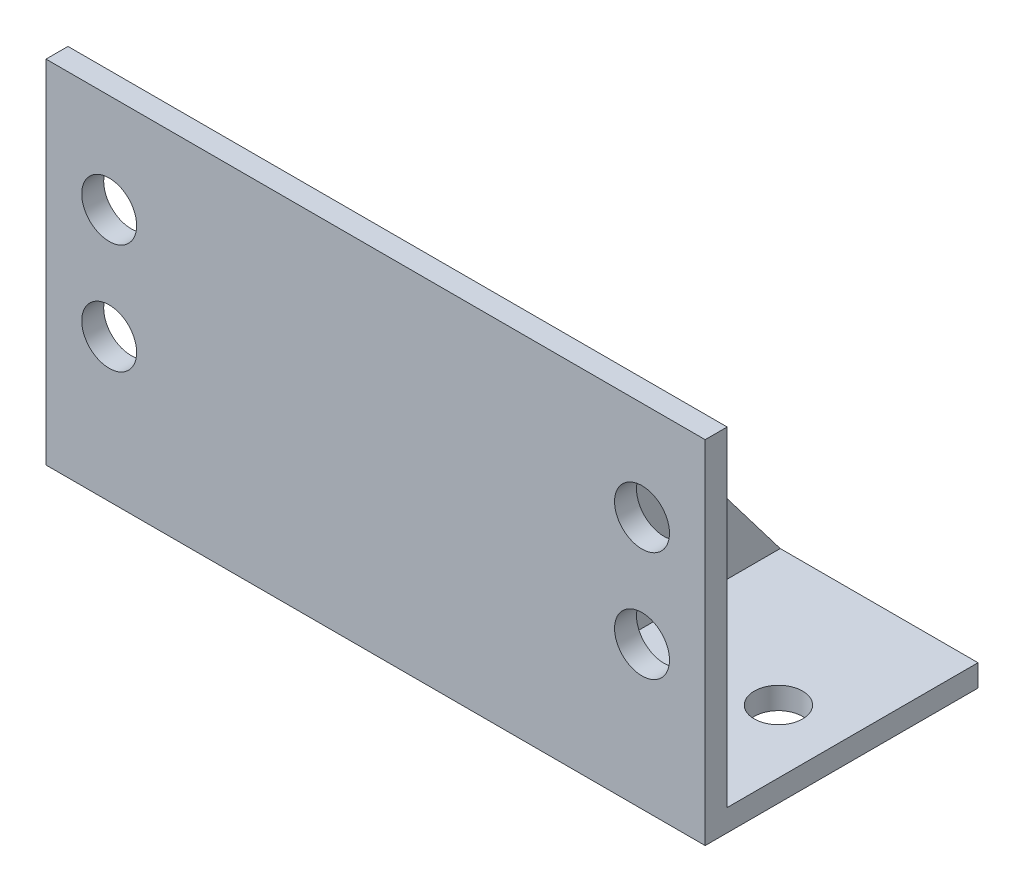
ISO-10303-21;
HEADER;
FILE_DESCRIPTION(('STEP AP214'),'2;1');
FILE_NAME('part.step','',(''),(''),'','','');
FILE_SCHEMA(('AUTOMOTIVE_DESIGN { 1 0 10303 214 1 1 1 1 }'));
ENDSEC;
DATA;
#1=APPLICATION_CONTEXT('core data for automotive mechanical design processes');
#2=APPLICATION_PROTOCOL_DEFINITION('international standard','automotive_design',2000,#1);
#3=PRODUCT_CONTEXT('',#1,'mechanical');
#4=PRODUCT('Part','Part','',(#3));
#5=PRODUCT_RELATED_PRODUCT_CATEGORY('part','',(#4));
#6=PRODUCT_DEFINITION_FORMATION('','',#4);
#7=PRODUCT_DEFINITION_CONTEXT('part definition',#1,'design');
#8=PRODUCT_DEFINITION('design','',#6,#7);
#9=PRODUCT_DEFINITION_SHAPE('','',#8);
#10=(LENGTH_UNIT() NAMED_UNIT(*) SI_UNIT(.MILLI.,.METRE.));
#11=(NAMED_UNIT(*) PLANE_ANGLE_UNIT() SI_UNIT($,.RADIAN.));
#12=(NAMED_UNIT(*) SI_UNIT($,.STERADIAN.) SOLID_ANGLE_UNIT());
#13=UNCERTAINTY_MEASURE_WITH_UNIT(LENGTH_MEASURE(1.E-05),#10,'distance_accuracy_value','');
#14=(GEOMETRIC_REPRESENTATION_CONTEXT(3) GLOBAL_UNCERTAINTY_ASSIGNED_CONTEXT((#13)) GLOBAL_UNIT_ASSIGNED_CONTEXT((#10,
#11,#12)) REPRESENTATION_CONTEXT('',''));
#15=CARTESIAN_POINT('',(0.,0.,0.));
#16=DIRECTION('',(0.,0.,1.));
#17=DIRECTION('',(1.,0.,0.));
#18=AXIS2_PLACEMENT_3D('',#15,#16,#17);
#19=CARTESIAN_POINT('',(10.,32.,-12.4164964055997));
#20=DIRECTION('',(1.,0.,0.));
#21=DIRECTION('',(0.,0.,-1.));
#22=AXIS2_PLACEMENT_3D('',#19,#20,#21);
#23=PLANE('',#22);
#24=DIRECTION('',(0.,0.795740414878261,0.605637839083205));
#25=VECTOR('',#24,1.);
#26=CARTESIAN_POINT('',(10.,20.9960842361188,2.04141875454158));
#27=LINE('',#26,#25);
#28=CARTESIAN_POINT('',(10.,2.,-12.4164964055997));
#29=VERTEX_POINT('',#28);
#30=CARTESIAN_POINT('',(10.,32.,10.4164964055997));
#31=VERTEX_POINT('',#30);
#32=EDGE_CURVE('E245',#29,#31,#27,.T.);
#33=ORIENTED_EDGE('',*,*,#32,.F.);
#34=DIRECTION('',(0.,0.,1.));
#35=VECTOR('',#34,1.);
#36=CARTESIAN_POINT('',(10.,2.,-12.4164964055997));
#37=LINE('',#36,#35);
#38=CARTESIAN_POINT('',(10.,2.,10.4164964055997));
#39=VERTEX_POINT('',#38);
#40=EDGE_CURVE('E231',#29,#39,#37,.T.);
#41=ORIENTED_EDGE('',*,*,#40,.T.);
#42=DIRECTION('',(0.,-1.,0.));
#43=VECTOR('',#42,1.);
#44=CARTESIAN_POINT('',(10.,32.,10.4164964055997));
#45=LINE('',#44,#43);
#46=EDGE_CURVE('E234',#31,#39,#45,.T.);
#47=ORIENTED_EDGE('',*,*,#46,.F.);
#48=EDGE_LOOP('',(#33,#41,#47));
#49=FACE_BOUND('',#48,.T.);
#50=ADVANCED_FACE('F88',(#49),#23,.F.);
#51=CARTESIAN_POINT('',(12.,32.,-12.4164964055997));
#52=DIRECTION('',(1.,0.,0.));
#53=DIRECTION('',(0.,0.,-1.));
#54=AXIS2_PLACEMENT_3D('',#51,#52,#53);
#55=PLANE('',#54);
#56=DIRECTION('',(0.,0.,1.));
#57=VECTOR('',#56,1.);
#58=CARTESIAN_POINT('',(12.,2.,-12.4164964055997));
#59=LINE('',#58,#57);
#60=CARTESIAN_POINT('',(12.,2.,-12.4164964055997));
#61=VERTEX_POINT('',#60);
#62=CARTESIAN_POINT('',(12.,2.,10.4164964055997));
#63=VERTEX_POINT('',#62);
#64=EDGE_CURVE('E103',#61,#63,#59,.T.);
#65=ORIENTED_EDGE('',*,*,#64,.F.);
#66=DIRECTION('',(0.,0.795740414878261,0.605637839083205));
#67=VECTOR('',#66,1.);
#68=CARTESIAN_POINT('',(12.,20.9960842361188,2.04141875454158));
#69=LINE('',#68,#67);
#70=CARTESIAN_POINT('',(12.,32.,10.4164964055997));
#71=VERTEX_POINT('',#70);
#72=EDGE_CURVE('E242',#61,#71,#69,.T.);
#73=ORIENTED_EDGE('',*,*,#72,.T.);
#74=DIRECTION('',(0.,-1.,0.));
#75=VECTOR('',#74,1.);
#76=CARTESIAN_POINT('',(12.,32.,10.4164964055997));
#77=LINE('',#76,#75);
#78=EDGE_CURVE('E235',#71,#63,#77,.T.);
#79=ORIENTED_EDGE('',*,*,#78,.T.);
#80=EDGE_LOOP('',(#65,#73,#79));
#81=FACE_BOUND('',#80,.T.);
#82=ADVANCED_FACE('F361',(#81),#55,.T.);
#83=CARTESIAN_POINT('',(-10.,32.,-12.4164964055997));
#84=DIRECTION('',(1.,0.,0.));
#85=DIRECTION('',(0.,0.,-1.));
#86=AXIS2_PLACEMENT_3D('',#83,#84,#85);
#87=PLANE('',#86);
#88=DIRECTION('',(0.,0.,1.));
#89=VECTOR('',#88,1.);
#90=CARTESIAN_POINT('',(-10.,2.,-12.4164964055997));
#91=LINE('',#90,#89);
#92=CARTESIAN_POINT('',(-10.,2.,-12.4164964055997));
#93=VERTEX_POINT('',#92);
#94=CARTESIAN_POINT('',(-10.,2.,10.4164964055997));
#95=VERTEX_POINT('',#94);
#96=EDGE_CURVE('E244',#93,#95,#91,.T.);
#97=ORIENTED_EDGE('',*,*,#96,.F.);
#98=DIRECTION('',(0.,0.795740414878261,0.605637839083205));
#99=VECTOR('',#98,1.);
#100=CARTESIAN_POINT('',(-10.,20.9960842361188,2.04141875454158));
#101=LINE('',#100,#99);
#102=CARTESIAN_POINT('',(-10.,32.,10.4164964055997));
#103=VERTEX_POINT('',#102);
#104=EDGE_CURVE('E12',#93,#103,#101,.T.);
#105=ORIENTED_EDGE('',*,*,#104,.T.);
#106=DIRECTION('',(0.,-1.,0.));
#107=VECTOR('',#106,1.);
#108=CARTESIAN_POINT('',(-10.,32.,10.4164964055997));
#109=LINE('',#108,#107);
#110=EDGE_CURVE('E206',#103,#95,#109,.T.);
#111=ORIENTED_EDGE('',*,*,#110,.T.);
#112=EDGE_LOOP('',(#97,#105,#111));
#113=FACE_BOUND('',#112,.T.);
#114=ADVANCED_FACE('F372',(#113),#87,.T.);
#115=CARTESIAN_POINT('',(0.,2.,0.));
#116=DIRECTION('',(0.,1.,0.));
#117=DIRECTION('',(0.,0.,1.));
#118=AXIS2_PLACEMENT_3D('',#115,#116,#117);
#119=PLANE('',#118);
#120=CARTESIAN_POINT('',(24.25,2.,0.));
#121=DIRECTION('',(0.,1.,0.));
#122=DIRECTION('',(0.,0.,1.));
#123=AXIS2_PLACEMENT_3D('',#120,#121,#122);
#124=CIRCLE('',#123,2.2);
#125=CARTESIAN_POINT('',(24.25,2.,2.2));
#126=VERTEX_POINT('',#125);
#127=EDGE_CURVE('E341',#126,#126,#124,.T.);
#128=ORIENTED_EDGE('',*,*,#127,.F.);
#129=EDGE_LOOP('',(#128));
#130=FACE_BOUND('',#129,.T.);
#131=DIRECTION('',(1.,0.,0.));
#132=VECTOR('',#131,1.);
#133=CARTESIAN_POINT('',(-30.,2.,-12.4164964055997));
#134=LINE('',#133,#132);
#135=CARTESIAN_POINT('',(30.,2.,-12.4164964055997));
#136=VERTEX_POINT('',#135);
#137=EDGE_CURVE('E351',#61,#136,#134,.T.);
#138=ORIENTED_EDGE('',*,*,#137,.F.);
#139=ORIENTED_EDGE('',*,*,#64,.T.);
#140=DIRECTION('',(1.,0.,0.));
#141=VECTOR('',#140,1.);
#142=CARTESIAN_POINT('',(-30.,2.,10.4164964055997));
#143=LINE('',#142,#141);
#144=CARTESIAN_POINT('',(30.,2.,10.4164964055997));
#145=VERTEX_POINT('',#144);
#146=EDGE_CURVE('E323',#63,#145,#143,.T.);
#147=ORIENTED_EDGE('',*,*,#146,.T.);
#148=DIRECTION('',(0.,0.,1.));
#149=VECTOR('',#148,1.);
#150=CARTESIAN_POINT('',(30.,2.,-12.4164964055997));
#151=LINE('',#150,#149);
#152=EDGE_CURVE('E353',#136,#145,#151,.T.);
#153=ORIENTED_EDGE('',*,*,#152,.F.);
#154=EDGE_LOOP('',(#138,#139,#147,#153));
#155=FACE_BOUND('',#154,.T.);
#156=ADVANCED_FACE('F363',(#130,#155),#119,.T.);
#157=CARTESIAN_POINT('',(-24.25,2.,0.));
#158=DIRECTION('',(0.,1.,0.));
#159=DIRECTION('',(0.,0.,1.));
#160=AXIS2_PLACEMENT_3D('',#157,#158,#159);
#161=CIRCLE('',#160,2.2);
#162=CARTESIAN_POINT('',(-24.25,2.,2.2));
#163=VERTEX_POINT('',#162);
#164=EDGE_CURVE('E334',#163,#163,#161,.T.);
#165=ORIENTED_EDGE('',*,*,#164,.F.);
#166=EDGE_LOOP('',(#165));
#167=FACE_BOUND('',#166,.T.);
#168=DIRECTION('',(0.,0.,1.));
#169=VECTOR('',#168,1.);
#170=CARTESIAN_POINT('',(-30.,2.,-12.4164964055997));
#171=LINE('',#170,#169);
#172=CARTESIAN_POINT('',(-30.,2.,-12.4164964055997));
#173=VERTEX_POINT('',#172);
#174=CARTESIAN_POINT('',(-30.,2.,10.4164964055997));
#175=VERTEX_POINT('',#174);
#176=EDGE_CURVE('E295',#173,#175,#171,.T.);
#177=ORIENTED_EDGE('',*,*,#176,.T.);
#178=CARTESIAN_POINT('',(-12.,2.,10.4164964055997));
#179=VERTEX_POINT('',#178);
#180=EDGE_CURVE('E112',#175,#179,#143,.T.);
#181=ORIENTED_EDGE('',*,*,#180,.T.);
#182=DIRECTION('',(0.,0.,1.));
#183=VECTOR('',#182,1.);
#184=CARTESIAN_POINT('',(-12.,2.,-12.4164964055997));
#185=LINE('',#184,#183);
#186=CARTESIAN_POINT('',(-12.,2.,-12.4164964055997));
#187=VERTEX_POINT('',#186);
#188=EDGE_CURVE('E204',#187,#179,#185,.T.);
#189=ORIENTED_EDGE('',*,*,#188,.F.);
#190=EDGE_CURVE('E299',#173,#187,#134,.T.);
#191=ORIENTED_EDGE('',*,*,#190,.F.);
#192=EDGE_LOOP('',(#177,#181,#189,#191));
#193=FACE_BOUND('',#192,.T.);
#194=ADVANCED_FACE('F381',(#167,#193),#119,.T.);
#195=CARTESIAN_POINT('',(0.,2.,0.));
#196=DIRECTION('',(0.,1.,0.));
#197=DIRECTION('',(0.,0.,1.));
#198=AXIS2_PLACEMENT_3D('',#195,#196,#197);
#199=CIRCLE('',#198,2.2);
#200=CARTESIAN_POINT('',(0.,2.,2.2));
#201=VERTEX_POINT('',#200);
#202=EDGE_CURVE('E339',#201,#201,#199,.T.);
#203=ORIENTED_EDGE('',*,*,#202,.F.);
#204=EDGE_LOOP('',(#203));
#205=FACE_BOUND('',#204,.T.);
#206=EDGE_CURVE('E352',#93,#29,#134,.T.);
#207=ORIENTED_EDGE('',*,*,#206,.F.);
#208=ORIENTED_EDGE('',*,*,#96,.T.);
#209=EDGE_CURVE('E326',#95,#39,#143,.T.);
#210=ORIENTED_EDGE('',*,*,#209,.T.);
#211=ORIENTED_EDGE('',*,*,#40,.F.);
#212=EDGE_LOOP('',(#207,#208,#210,#211));
#213=FACE_BOUND('',#212,.T.);
#214=ADVANCED_FACE('F375',(#205,#213),#119,.T.);
#215=CARTESIAN_POINT('',(0.,0.,0.));
#216=DIRECTION('',(0.,1.,0.));
#217=DIRECTION('',(0.,0.,1.));
#218=AXIS2_PLACEMENT_3D('',#215,#216,#217);
#219=PLANE('',#218);
#220=DIRECTION('',(0.,0.,1.));
#221=VECTOR('',#220,1.);
#222=CARTESIAN_POINT('',(-30.,0.,-12.4164964055997));
#223=LINE('',#222,#221);
#224=CARTESIAN_POINT('',(-30.,0.,-12.4164964055997));
#225=VERTEX_POINT('',#224);
#226=CARTESIAN_POINT('',(-30.,0.,12.4164964055997));
#227=VERTEX_POINT('',#226);
#228=EDGE_CURVE('E285',#225,#227,#223,.T.);
#229=ORIENTED_EDGE('',*,*,#228,.F.);
#230=DIRECTION('',(1.,0.,0.));
#231=VECTOR('',#230,1.);
#232=CARTESIAN_POINT('',(-30.,0.,-12.4164964055997));
#233=LINE('',#232,#231);
#234=CARTESIAN_POINT('',(30.,0.,-12.4164964055997));
#235=VERTEX_POINT('',#234);
#236=EDGE_CURVE('E289',#225,#235,#233,.T.);
#237=ORIENTED_EDGE('',*,*,#236,.T.);
#238=DIRECTION('',(0.,0.,1.));
#239=VECTOR('',#238,1.);
#240=CARTESIAN_POINT('',(30.,0.,-12.4164964055997));
#241=LINE('',#240,#239);
#242=CARTESIAN_POINT('',(30.,0.,12.4164964055997));
#243=VERTEX_POINT('',#242);
#244=EDGE_CURVE('E283',#235,#243,#241,.T.);
#245=ORIENTED_EDGE('',*,*,#244,.T.);
#246=DIRECTION('',(1.,0.,0.));
#247=VECTOR('',#246,1.);
#248=CARTESIAN_POINT('',(-30.,0.,12.4164964055997));
#249=LINE('',#248,#247);
#250=EDGE_CURVE('E273',#227,#243,#249,.T.);
#251=ORIENTED_EDGE('',*,*,#250,.F.);
#252=EDGE_LOOP('',(#229,#237,#245,#251));
#253=FACE_BOUND('',#252,.T.);
#254=CARTESIAN_POINT('',(24.25,0.,0.));
#255=DIRECTION('',(0.,1.,0.));
#256=DIRECTION('',(0.,0.,1.));
#257=AXIS2_PLACEMENT_3D('',#254,#255,#256);
#258=CIRCLE('',#257,2.2);
#259=CARTESIAN_POINT('',(24.25,0.,2.2));
#260=VERTEX_POINT('',#259);
#261=EDGE_CURVE('E345',#260,#260,#258,.T.);
#262=ORIENTED_EDGE('',*,*,#261,.T.);
#263=EDGE_LOOP('',(#262));
#264=FACE_BOUND('',#263,.T.);
#265=CARTESIAN_POINT('',(0.,0.,0.));
#266=DIRECTION('',(0.,1.,0.));
#267=DIRECTION('',(0.,0.,1.));
#268=AXIS2_PLACEMENT_3D('',#265,#266,#267);
#269=CIRCLE('',#268,2.2);
#270=CARTESIAN_POINT('',(0.,0.,2.2));
#271=VERTEX_POINT('',#270);
#272=EDGE_CURVE('E338',#271,#271,#269,.T.);
#273=ORIENTED_EDGE('',*,*,#272,.T.);
#274=EDGE_LOOP('',(#273));
#275=FACE_BOUND('',#274,.T.);
#276=CARTESIAN_POINT('',(-24.25,0.,0.));
#277=DIRECTION('',(0.,1.,0.));
#278=DIRECTION('',(0.,0.,1.));
#279=AXIS2_PLACEMENT_3D('',#276,#277,#278);
#280=CIRCLE('',#279,2.2);
#281=CARTESIAN_POINT('',(-24.25,0.,2.2));
#282=VERTEX_POINT('',#281);
#283=EDGE_CURVE('E236',#282,#282,#280,.T.);
#284=ORIENTED_EDGE('',*,*,#283,.T.);
#285=EDGE_LOOP('',(#284));
#286=FACE_BOUND('',#285,.T.);
#287=ADVANCED_FACE('F287',(#253,#264,#275,#286),#219,.F.);
#288=CARTESIAN_POINT('',(-30.,2.,-12.4164964055997));
#289=DIRECTION('',(1.,0.,0.));
#290=DIRECTION('',(0.,0.,-1.));
#291=AXIS2_PLACEMENT_3D('',#288,#289,#290);
#292=PLANE('',#291);
#293=ORIENTED_EDGE('',*,*,#228,.T.);
#294=DIRECTION('',(0.,-1.,0.));
#295=VECTOR('',#294,1.);
#296=CARTESIAN_POINT('',(-30.,2.,12.4164964055997));
#297=LINE('',#296,#295);
#298=CARTESIAN_POINT('',(-30.,32.,12.4164964055997));
#299=VERTEX_POINT('',#298);
#300=EDGE_CURVE('E92',#299,#227,#297,.T.);
#301=ORIENTED_EDGE('',*,*,#300,.F.);
#302=DIRECTION('',(0.,0.,1.));
#303=VECTOR('',#302,1.);
#304=CARTESIAN_POINT('',(-30.,32.,10.4164964055997));
#305=LINE('',#304,#303);
#306=CARTESIAN_POINT('',(-30.,32.,10.4164964055997));
#307=VERTEX_POINT('',#306);
#308=EDGE_CURVE('E226',#307,#299,#305,.T.);
#309=ORIENTED_EDGE('',*,*,#308,.F.);
#310=DIRECTION('',(0.,-1.,0.));
#311=VECTOR('',#310,1.);
#312=CARTESIAN_POINT('',(-30.,32.,10.4164964055997));
#313=LINE('',#312,#311);
#314=EDGE_CURVE('E211',#307,#175,#313,.T.);
#315=ORIENTED_EDGE('',*,*,#314,.T.);
#316=ORIENTED_EDGE('',*,*,#176,.F.);
#317=DIRECTION('',(0.,-1.,0.));
#318=VECTOR('',#317,1.);
#319=CARTESIAN_POINT('',(-30.,2.,-12.4164964055997));
#320=LINE('',#319,#318);
#321=EDGE_CURVE('E298',#173,#225,#320,.T.);
#322=ORIENTED_EDGE('',*,*,#321,.T.);
#323=EDGE_LOOP('',(#293,#301,#309,#315,#316,#322));
#324=FACE_BOUND('',#323,.T.);
#325=ADVANCED_FACE('F86',(#324),#292,.F.);
#326=CARTESIAN_POINT('',(-30.,2.,12.4164964055997));
#327=DIRECTION('',(0.,0.,-1.));
#328=DIRECTION('',(-1.,0.,0.));
#329=AXIS2_PLACEMENT_3D('',#326,#327,#328);
#330=PLANE('',#329);
#331=CARTESIAN_POINT('',(-24.25,23.,12.4164964055997));
#332=DIRECTION('',(0.,0.,1.));
#333=DIRECTION('',(1.,0.,0.));
#334=AXIS2_PLACEMENT_3D('',#331,#332,#333);
#335=CIRCLE('',#334,2.5);
#336=CARTESIAN_POINT('',(-21.75,23.,12.4164964055997));
#337=VERTEX_POINT('',#336);
#338=EDGE_CURVE('E251',#337,#337,#335,.T.);
#339=ORIENTED_EDGE('',*,*,#338,.F.);
#340=EDGE_LOOP('',(#339));
#341=FACE_BOUND('',#340,.T.);
#342=CARTESIAN_POINT('',(24.25,13.,12.4164964055997));
#343=DIRECTION('',(0.,0.,1.));
#344=DIRECTION('',(1.,0.,0.));
#345=AXIS2_PLACEMENT_3D('',#342,#343,#344);
#346=CIRCLE('',#345,2.5);
#347=CARTESIAN_POINT('',(26.75,13.,12.4164964055997));
#348=VERTEX_POINT('',#347);
#349=EDGE_CURVE('E255',#348,#348,#346,.T.);
#350=ORIENTED_EDGE('',*,*,#349,.F.);
#351=EDGE_LOOP('',(#350));
#352=FACE_BOUND('',#351,.T.);
#353=CARTESIAN_POINT('',(24.25,23.,12.4164964055997));
#354=DIRECTION('',(0.,0.,1.));
#355=DIRECTION('',(1.,0.,0.));
#356=AXIS2_PLACEMENT_3D('',#353,#354,#355);
#357=CIRCLE('',#356,2.5);
#358=CARTESIAN_POINT('',(26.75,23.,12.4164964055997));
#359=VERTEX_POINT('',#358);
#360=EDGE_CURVE('E260',#359,#359,#357,.T.);
#361=ORIENTED_EDGE('',*,*,#360,.F.);
#362=EDGE_LOOP('',(#361));
#363=FACE_BOUND('',#362,.T.);
#364=CARTESIAN_POINT('',(-24.25,13.,12.4164964055997));
#365=DIRECTION('',(0.,0.,1.));
#366=DIRECTION('',(1.,0.,0.));
#367=AXIS2_PLACEMENT_3D('',#364,#365,#366);
#368=CIRCLE('',#367,2.5);
#369=CARTESIAN_POINT('',(-21.75,13.,12.4164964055997));
#370=VERTEX_POINT('',#369);
#371=EDGE_CURVE('E249',#370,#370,#368,.T.);
#372=ORIENTED_EDGE('',*,*,#371,.F.);
#373=EDGE_LOOP('',(#372));
#374=FACE_BOUND('',#373,.T.);
#375=ORIENTED_EDGE('',*,*,#250,.T.);
#376=DIRECTION('',(0.,-1.,0.));
#377=VECTOR('',#376,1.);
#378=CARTESIAN_POINT('',(30.,2.,12.4164964055997));
#379=LINE('',#378,#377);
#380=CARTESIAN_POINT('',(30.,32.,12.4164964055997));
#381=VERTEX_POINT('',#380);
#382=EDGE_CURVE('E280',#381,#243,#379,.T.);
#383=ORIENTED_EDGE('',*,*,#382,.F.);
#384=DIRECTION('',(1.,0.,0.));
#385=VECTOR('',#384,1.);
#386=CARTESIAN_POINT('',(-30.,32.,12.4164964055997));
#387=LINE('',#386,#385);
#388=EDGE_CURVE('E221',#299,#381,#387,.T.);
#389=ORIENTED_EDGE('',*,*,#388,.F.);
#390=ORIENTED_EDGE('',*,*,#300,.T.);
#391=EDGE_LOOP('',(#375,#383,#389,#390));
#392=FACE_BOUND('',#391,.T.);
#393=ADVANCED_FACE('F264',(#341,#352,#363,#374,#392),#330,.F.);
#394=CARTESIAN_POINT('',(30.,2.,-12.4164964055997));
#395=DIRECTION('',(1.,0.,0.));
#396=DIRECTION('',(0.,0.,-1.));
#397=AXIS2_PLACEMENT_3D('',#394,#395,#396);
#398=PLANE('',#397);
#399=ORIENTED_EDGE('',*,*,#244,.F.);
#400=DIRECTION('',(0.,-1.,0.));
#401=VECTOR('',#400,1.);
#402=CARTESIAN_POINT('',(30.,2.,-12.4164964055997));
#403=LINE('',#402,#401);
#404=EDGE_CURVE('E296',#136,#235,#403,.T.);
#405=ORIENTED_EDGE('',*,*,#404,.F.);
#406=ORIENTED_EDGE('',*,*,#152,.T.);
#407=DIRECTION('',(0.,-1.,0.));
#408=VECTOR('',#407,1.);
#409=CARTESIAN_POINT('',(30.,32.,10.4164964055997));
#410=LINE('',#409,#408);
#411=CARTESIAN_POINT('',(30.,32.,10.4164964055997));
#412=VERTEX_POINT('',#411);
#413=EDGE_CURVE('E210',#412,#145,#410,.T.);
#414=ORIENTED_EDGE('',*,*,#413,.F.);
#415=DIRECTION('',(0.,0.,1.));
#416=VECTOR('',#415,1.);
#417=CARTESIAN_POINT('',(30.,32.,10.4164964055997));
#418=LINE('',#417,#416);
#419=EDGE_CURVE('E217',#412,#381,#418,.T.);
#420=ORIENTED_EDGE('',*,*,#419,.T.);
#421=ORIENTED_EDGE('',*,*,#382,.T.);
#422=EDGE_LOOP('',(#399,#405,#406,#414,#420,#421));
#423=FACE_BOUND('',#422,.T.);
#424=ADVANCED_FACE('F268',(#423),#398,.T.);
#425=CARTESIAN_POINT('',(-30.,2.,-12.4164964055997));
#426=DIRECTION('',(0.,0.,-1.));
#427=DIRECTION('',(-1.,0.,0.));
#428=AXIS2_PLACEMENT_3D('',#425,#426,#427);
#429=PLANE('',#428);
#430=DIRECTION('',(-1.,0.,0.));
#431=VECTOR('',#430,1.);
#432=CARTESIAN_POINT('',(30.,2.,-12.4164964055997));
#433=LINE('',#432,#431);
#434=EDGE_CURVE('E199',#61,#29,#433,.T.);
#435=ORIENTED_EDGE('',*,*,#434,.F.);
#436=ORIENTED_EDGE('',*,*,#137,.T.);
#437=ORIENTED_EDGE('',*,*,#404,.T.);
#438=ORIENTED_EDGE('',*,*,#236,.F.);
#439=ORIENTED_EDGE('',*,*,#321,.F.);
#440=ORIENTED_EDGE('',*,*,#190,.T.);
#441=EDGE_CURVE('E181',#93,#187,#433,.T.);
#442=ORIENTED_EDGE('',*,*,#441,.F.);
#443=ORIENTED_EDGE('',*,*,#206,.T.);
#444=EDGE_LOOP('',(#435,#436,#437,#438,#439,#440,#442,#443));
#445=FACE_BOUND('',#444,.T.);
#446=ADVANCED_FACE('F356',(#445),#429,.T.);
#447=CARTESIAN_POINT('',(24.25,2.,0.));
#448=DIRECTION('',(0.,-1.,0.));
#449=DIRECTION('',(0.,0.,-1.));
#450=AXIS2_PLACEMENT_3D('',#447,#448,#449);
#451=CYLINDRICAL_SURFACE('',#450,2.2);
#452=ORIENTED_EDGE('',*,*,#127,.T.);
#453=EDGE_LOOP('',(#452));
#454=FACE_BOUND('',#453,.T.);
#455=ORIENTED_EDGE('',*,*,#261,.F.);
#456=EDGE_LOOP('',(#455));
#457=FACE_BOUND('',#456,.T.);
#458=ADVANCED_FACE('F414',(#454,#457),#451,.F.);
#459=CARTESIAN_POINT('',(0.,2.,0.));
#460=DIRECTION('',(0.,-1.,0.));
#461=DIRECTION('',(0.,0.,-1.));
#462=AXIS2_PLACEMENT_3D('',#459,#460,#461);
#463=CYLINDRICAL_SURFACE('',#462,2.2);
#464=ORIENTED_EDGE('',*,*,#202,.T.);
#465=EDGE_LOOP('',(#464));
#466=FACE_BOUND('',#465,.T.);
#467=ORIENTED_EDGE('',*,*,#272,.F.);
#468=EDGE_LOOP('',(#467));
#469=FACE_BOUND('',#468,.T.);
#470=ADVANCED_FACE('F412',(#466,#469),#463,.F.);
#471=CARTESIAN_POINT('',(-24.25,2.,0.));
#472=DIRECTION('',(0.,-1.,0.));
#473=DIRECTION('',(0.,0.,-1.));
#474=AXIS2_PLACEMENT_3D('',#471,#472,#473);
#475=CYLINDRICAL_SURFACE('',#474,2.2);
#476=ORIENTED_EDGE('',*,*,#164,.T.);
#477=EDGE_LOOP('',(#476));
#478=FACE_BOUND('',#477,.T.);
#479=ORIENTED_EDGE('',*,*,#283,.F.);
#480=EDGE_LOOP('',(#479));
#481=FACE_BOUND('',#480,.T.);
#482=ADVANCED_FACE('F406',(#478,#481),#475,.F.);
#483=CARTESIAN_POINT('',(0.,32.,0.));
#484=DIRECTION('',(0.,-1.,0.));
#485=DIRECTION('',(0.,0.,-1.));
#486=AXIS2_PLACEMENT_3D('',#483,#484,#485);
#487=PLANE('',#486);
#488=DIRECTION('',(1.,0.,0.));
#489=VECTOR('',#488,1.);
#490=CARTESIAN_POINT('',(-30.,32.,10.4164964055997));
#491=LINE('',#490,#489);
#492=EDGE_CURVE('E212',#71,#412,#491,.T.);
#493=ORIENTED_EDGE('',*,*,#492,.F.);
#494=DIRECTION('',(-1.,0.,0.));
#495=VECTOR('',#494,1.);
#496=CARTESIAN_POINT('',(30.,32.,10.4164964055997));
#497=LINE('',#496,#495);
#498=EDGE_CURVE('E200',#71,#31,#497,.T.);
#499=ORIENTED_EDGE('',*,*,#498,.T.);
#500=EDGE_CURVE('E196',#103,#31,#491,.T.);
#501=ORIENTED_EDGE('',*,*,#500,.F.);
#502=CARTESIAN_POINT('',(-12.,32.,10.4164964055997));
#503=VERTEX_POINT('',#502);
#504=EDGE_CURVE('E182',#103,#503,#497,.T.);
#505=ORIENTED_EDGE('',*,*,#504,.T.);
#506=EDGE_CURVE('E191',#307,#503,#491,.T.);
#507=ORIENTED_EDGE('',*,*,#506,.F.);
#508=ORIENTED_EDGE('',*,*,#308,.T.);
#509=ORIENTED_EDGE('',*,*,#388,.T.);
#510=ORIENTED_EDGE('',*,*,#419,.F.);
#511=EDGE_LOOP('',(#493,#499,#501,#505,#507,#508,#509,#510));
#512=FACE_BOUND('',#511,.T.);
#513=ADVANCED_FACE('F195',(#512),#487,.F.);
#514=CARTESIAN_POINT('',(-12.,32.,-12.4164964055997));
#515=DIRECTION('',(1.,0.,0.));
#516=DIRECTION('',(0.,0.,-1.));
#517=AXIS2_PLACEMENT_3D('',#514,#515,#516);
#518=PLANE('',#517);
#519=DIRECTION('',(0.,-1.,0.));
#520=VECTOR('',#519,1.);
#521=CARTESIAN_POINT('',(-12.,32.,10.4164964055997));
#522=LINE('',#521,#520);
#523=EDGE_CURVE('E205',#503,#179,#522,.T.);
#524=ORIENTED_EDGE('',*,*,#523,.F.);
#525=DIRECTION('',(0.,-0.795740414878261,-0.605637839083205));
#526=VECTOR('',#525,1.);
#527=CARTESIAN_POINT('',(-12.,32.,10.4164964055997));
#528=LINE('',#527,#526);
#529=EDGE_CURVE('E178',#503,#187,#528,.T.);
#530=ORIENTED_EDGE('',*,*,#529,.T.);
#531=ORIENTED_EDGE('',*,*,#188,.T.);
#532=EDGE_LOOP('',(#524,#530,#531));
#533=FACE_BOUND('',#532,.T.);
#534=ADVANCED_FACE('F201',(#533),#518,.F.);
#535=CARTESIAN_POINT('',(-30.,32.,10.4164964055997));
#536=DIRECTION('',(0.,0.,-1.));
#537=DIRECTION('',(-1.,0.,0.));
#538=AXIS2_PLACEMENT_3D('',#535,#536,#537);
#539=PLANE('',#538);
#540=CARTESIAN_POINT('',(24.25,13.,10.4164964055997));
#541=DIRECTION('',(0.,0.,-1.));
#542=DIRECTION('',(-1.,0.,0.));
#543=AXIS2_PLACEMENT_3D('',#540,#541,#542);
#544=CIRCLE('',#543,2.5);
#545=CARTESIAN_POINT('',(21.75,13.,10.4164964055997));
#546=VERTEX_POINT('',#545);
#547=EDGE_CURVE('E89',#546,#546,#544,.T.);
#548=ORIENTED_EDGE('',*,*,#547,.F.);
#549=EDGE_LOOP('',(#548));
#550=FACE_BOUND('',#549,.T.);
#551=CARTESIAN_POINT('',(24.25,23.,10.4164964055997));
#552=DIRECTION('',(0.,0.,-1.));
#553=DIRECTION('',(-1.,0.,0.));
#554=AXIS2_PLACEMENT_3D('',#551,#552,#553);
#555=CIRCLE('',#554,2.5);
#556=CARTESIAN_POINT('',(21.75,23.,10.4164964055997));
#557=VERTEX_POINT('',#556);
#558=EDGE_CURVE('E307',#557,#557,#555,.T.);
#559=ORIENTED_EDGE('',*,*,#558,.F.);
#560=EDGE_LOOP('',(#559));
#561=FACE_BOUND('',#560,.T.);
#562=ORIENTED_EDGE('',*,*,#146,.F.);
#563=ORIENTED_EDGE('',*,*,#78,.F.);
#564=ORIENTED_EDGE('',*,*,#492,.T.);
#565=ORIENTED_EDGE('',*,*,#413,.T.);
#566=EDGE_LOOP('',(#562,#563,#564,#565));
#567=FACE_BOUND('',#566,.T.);
#568=ADVANCED_FACE('F320',(#550,#561,#567),#539,.T.);
#569=ORIENTED_EDGE('',*,*,#500,.T.);
#570=ORIENTED_EDGE('',*,*,#46,.T.);
#571=ORIENTED_EDGE('',*,*,#209,.F.);
#572=ORIENTED_EDGE('',*,*,#110,.F.);
#573=EDGE_LOOP('',(#569,#570,#571,#572));
#574=FACE_BOUND('',#573,.T.);
#575=ADVANCED_FACE('F319',(#574),#539,.T.);
#576=CARTESIAN_POINT('',(-24.25,23.,10.4164964055997));
#577=DIRECTION('',(0.,0.,-1.));
#578=DIRECTION('',(-1.,0.,0.));
#579=AXIS2_PLACEMENT_3D('',#576,#577,#578);
#580=CIRCLE('',#579,2.5);
#581=CARTESIAN_POINT('',(-26.75,23.,10.4164964055997));
#582=VERTEX_POINT('',#581);
#583=EDGE_CURVE('E301',#582,#582,#580,.T.);
#584=ORIENTED_EDGE('',*,*,#583,.F.);
#585=EDGE_LOOP('',(#584));
#586=FACE_BOUND('',#585,.T.);
#587=CARTESIAN_POINT('',(-24.25,13.,10.4164964055997));
#588=DIRECTION('',(0.,0.,-1.));
#589=DIRECTION('',(-1.,0.,0.));
#590=AXIS2_PLACEMENT_3D('',#587,#588,#589);
#591=CIRCLE('',#590,2.5);
#592=CARTESIAN_POINT('',(-26.75,13.,10.4164964055997));
#593=VERTEX_POINT('',#592);
#594=EDGE_CURVE('E252',#593,#593,#591,.T.);
#595=ORIENTED_EDGE('',*,*,#594,.F.);
#596=EDGE_LOOP('',(#595));
#597=FACE_BOUND('',#596,.T.);
#598=ORIENTED_EDGE('',*,*,#506,.T.);
#599=ORIENTED_EDGE('',*,*,#523,.T.);
#600=ORIENTED_EDGE('',*,*,#180,.F.);
#601=ORIENTED_EDGE('',*,*,#314,.F.);
#602=EDGE_LOOP('',(#598,#599,#600,#601));
#603=FACE_BOUND('',#602,.T.);
#604=ADVANCED_FACE('F207',(#586,#597,#603),#539,.T.);
#605=CARTESIAN_POINT('',(30.,32.,10.4164964055997));
#606=DIRECTION('',(0.,0.605637839083205,-0.795740414878261));
#607=DIRECTION('',(0.,0.795740414878261,0.605637839083205));
#608=AXIS2_PLACEMENT_3D('',#605,#606,#607);
#609=PLANE('',#608);
#610=ORIENTED_EDGE('',*,*,#441,.T.);
#611=ORIENTED_EDGE('',*,*,#529,.F.);
#612=ORIENTED_EDGE('',*,*,#504,.F.);
#613=ORIENTED_EDGE('',*,*,#104,.F.);
#614=EDGE_LOOP('',(#610,#611,#612,#613));
#615=FACE_BOUND('',#614,.T.);
#616=ADVANCED_FACE('F176',(#615),#609,.T.);
#617=ORIENTED_EDGE('',*,*,#32,.T.);
#618=ORIENTED_EDGE('',*,*,#498,.F.);
#619=ORIENTED_EDGE('',*,*,#72,.F.);
#620=ORIENTED_EDGE('',*,*,#434,.T.);
#621=EDGE_LOOP('',(#617,#618,#619,#620));
#622=FACE_BOUND('',#621,.T.);
#623=ADVANCED_FACE('F364',(#622),#609,.T.);
#624=CARTESIAN_POINT('',(-24.25,13.,-12.4164964055997));
#625=DIRECTION('',(0.,0.,1.));
#626=DIRECTION('',(1.,0.,0.));
#627=AXIS2_PLACEMENT_3D('',#624,#625,#626);
#628=CYLINDRICAL_SURFACE('',#627,2.5);
#629=ORIENTED_EDGE('',*,*,#594,.T.);
#630=EDGE_LOOP('',(#629));
#631=FACE_BOUND('',#630,.T.);
#632=ORIENTED_EDGE('',*,*,#371,.T.);
#633=EDGE_LOOP('',(#632));
#634=FACE_BOUND('',#633,.T.);
#635=ADVANCED_FACE('F511',(#631,#634),#628,.F.);
#636=CARTESIAN_POINT('',(-24.25,23.,-12.4164964055997));
#637=DIRECTION('',(0.,0.,1.));
#638=DIRECTION('',(1.,0.,0.));
#639=AXIS2_PLACEMENT_3D('',#636,#637,#638);
#640=CYLINDRICAL_SURFACE('',#639,2.5);
#641=ORIENTED_EDGE('',*,*,#583,.T.);
#642=EDGE_LOOP('',(#641));
#643=FACE_BOUND('',#642,.T.);
#644=ORIENTED_EDGE('',*,*,#338,.T.);
#645=EDGE_LOOP('',(#644));
#646=FACE_BOUND('',#645,.T.);
#647=ADVANCED_FACE('F520',(#643,#646),#640,.F.);
#648=CARTESIAN_POINT('',(24.25,23.,-12.4164964055997));
#649=DIRECTION('',(0.,0.,1.));
#650=DIRECTION('',(1.,0.,0.));
#651=AXIS2_PLACEMENT_3D('',#648,#649,#650);
#652=CYLINDRICAL_SURFACE('',#651,2.5);
#653=ORIENTED_EDGE('',*,*,#558,.T.);
#654=EDGE_LOOP('',(#653));
#655=FACE_BOUND('',#654,.T.);
#656=ORIENTED_EDGE('',*,*,#360,.T.);
#657=EDGE_LOOP('',(#656));
#658=FACE_BOUND('',#657,.T.);
#659=ADVANCED_FACE('F263',(#655,#658),#652,.F.);
#660=CARTESIAN_POINT('',(24.25,13.,-12.4164964055997));
#661=DIRECTION('',(0.,0.,1.));
#662=DIRECTION('',(1.,0.,0.));
#663=AXIS2_PLACEMENT_3D('',#660,#661,#662);
#664=CYLINDRICAL_SURFACE('',#663,2.5);
#665=ORIENTED_EDGE('',*,*,#547,.T.);
#666=EDGE_LOOP('',(#665));
#667=FACE_BOUND('',#666,.T.);
#668=ORIENTED_EDGE('',*,*,#349,.T.);
#669=EDGE_LOOP('',(#668));
#670=FACE_BOUND('',#669,.T.);
#671=ADVANCED_FACE('F314',(#667,#670),#664,.F.);
#672=CLOSED_SHELL('',(#50,#82,#114,#156,#194,#214,#287,#325,#393,#424,#446,#458,#470,#482,#513,
#534,#568,#575,#604,#616,#623,#635,#647,#659,#671));
#673=MANIFOLD_SOLID_BREP('B2',#672);
#674=ADVANCED_BREP_SHAPE_REPRESENTATION('',(#18,#673),#14);
#675=SHAPE_DEFINITION_REPRESENTATION(#9,#674);
ENDSEC;
END-ISO-10303-21;
